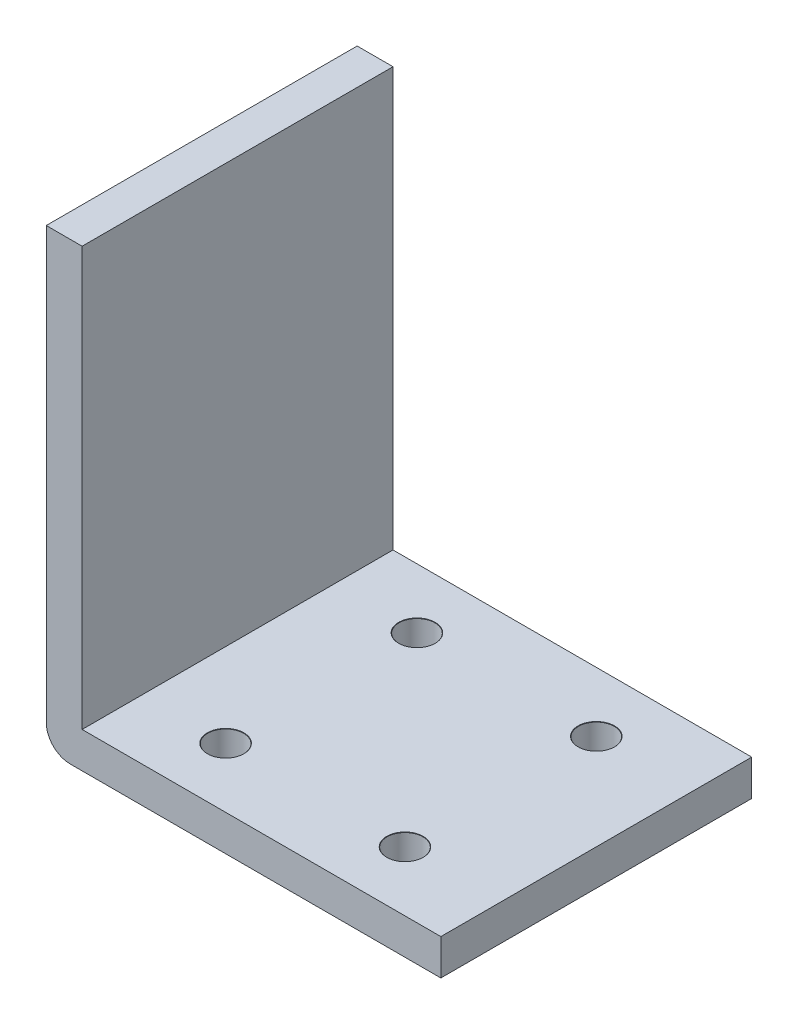
ISO-10303-21;
HEADER;
FILE_DESCRIPTION(('STEP AP214'),'2;1');
FILE_NAME('part.step','',(''),(''),'','','');
FILE_SCHEMA(('AUTOMOTIVE_DESIGN { 1 0 10303 214 1 1 1 1 }'));
ENDSEC;
DATA;
#1=APPLICATION_CONTEXT('core data for automotive mechanical design processes');
#2=APPLICATION_PROTOCOL_DEFINITION('international standard','automotive_design',2000,#1);
#3=PRODUCT_CONTEXT('',#1,'mechanical');
#4=PRODUCT('Part','Part','',(#3));
#5=PRODUCT_RELATED_PRODUCT_CATEGORY('part','',(#4));
#6=PRODUCT_DEFINITION_FORMATION('','',#4);
#7=PRODUCT_DEFINITION_CONTEXT('part definition',#1,'design');
#8=PRODUCT_DEFINITION('design','',#6,#7);
#9=PRODUCT_DEFINITION_SHAPE('','',#8);
#10=(LENGTH_UNIT() NAMED_UNIT(*) SI_UNIT(.MILLI.,.METRE.));
#11=(NAMED_UNIT(*) PLANE_ANGLE_UNIT() SI_UNIT($,.RADIAN.));
#12=(NAMED_UNIT(*) SI_UNIT($,.STERADIAN.) SOLID_ANGLE_UNIT());
#13=UNCERTAINTY_MEASURE_WITH_UNIT(LENGTH_MEASURE(1.E-05),#10,'distance_accuracy_value','');
#14=(GEOMETRIC_REPRESENTATION_CONTEXT(3) GLOBAL_UNCERTAINTY_ASSIGNED_CONTEXT((#13)) GLOBAL_UNIT_ASSIGNED_CONTEXT((#10,
#11,#12)) REPRESENTATION_CONTEXT('',''));
#15=CARTESIAN_POINT('',(0.,0.,0.));
#16=DIRECTION('',(0.,0.,1.));
#17=DIRECTION('',(1.,0.,0.));
#18=AXIS2_PLACEMENT_3D('',#15,#16,#17);
#19=CARTESIAN_POINT('',(0.,3.,0.));
#20=DIRECTION('',(0.,-1.,0.));
#21=DIRECTION('',(0.,0.,-1.));
#22=AXIS2_PLACEMENT_3D('',#19,#20,#21);
#23=PLANE('',#22);
#24=CARTESIAN_POINT('',(25.,3.,-21.));
#25=DIRECTION('',(0.,1.,0.));
#26=DIRECTION('',(0.,0.,1.));
#27=AXIS2_PLACEMENT_3D('',#24,#25,#26);
#28=CIRCLE('',#27,1.525);
#29=CARTESIAN_POINT('',(25.,3.,-19.475));
#30=VERTEX_POINT('',#29);
#31=EDGE_CURVE('E316',#30,#30,#28,.T.);
#32=ORIENTED_EDGE('',*,*,#31,.F.);
#33=EDGE_LOOP('',(#32));
#34=FACE_BOUND('',#33,.T.);
#35=CARTESIAN_POINT('',(9.99999999999999,3.,-21.));
#36=DIRECTION('',(0.,1.,0.));
#37=DIRECTION('',(0.,0.,1.));
#38=AXIS2_PLACEMENT_3D('',#35,#36,#37);
#39=CIRCLE('',#38,1.525);
#40=CARTESIAN_POINT('',(9.99999999999999,3.,-19.475));
#41=VERTEX_POINT('',#40);
#42=EDGE_CURVE('E323',#41,#41,#39,.T.);
#43=ORIENTED_EDGE('',*,*,#42,.F.);
#44=EDGE_LOOP('',(#43));
#45=FACE_BOUND('',#44,.T.);
#46=CARTESIAN_POINT('',(25.,3.,-5.));
#47=DIRECTION('',(0.,1.,0.));
#48=DIRECTION('',(0.,0.,1.));
#49=AXIS2_PLACEMENT_3D('',#46,#47,#48);
#50=CIRCLE('',#49,1.525);
#51=CARTESIAN_POINT('',(25.,3.,-3.475));
#52=VERTEX_POINT('',#51);
#53=EDGE_CURVE('E332',#52,#52,#50,.T.);
#54=ORIENTED_EDGE('',*,*,#53,.F.);
#55=EDGE_LOOP('',(#54));
#56=FACE_BOUND('',#55,.T.);
#57=DIRECTION('',(0.,0.,-1.));
#58=VECTOR('',#57,1.);
#59=CARTESIAN_POINT('',(3.,3.,-26.));
#60=LINE('',#59,#58);
#61=CARTESIAN_POINT('',(3.,3.,0.));
#62=VERTEX_POINT('',#61);
#63=CARTESIAN_POINT('',(3.,3.,-26.));
#64=VERTEX_POINT('',#63);
#65=EDGE_CURVE('E116',#62,#64,#60,.T.);
#66=ORIENTED_EDGE('',*,*,#65,.F.);
#67=DIRECTION('',(1.,0.,0.));
#68=VECTOR('',#67,1.);
#69=CARTESIAN_POINT('',(0.,3.,0.));
#70=LINE('',#69,#68);
#71=CARTESIAN_POINT('',(33.,3.,0.));
#72=VERTEX_POINT('',#71);
#73=EDGE_CURVE('E131',#62,#72,#70,.T.);
#74=ORIENTED_EDGE('',*,*,#73,.T.);
#75=DIRECTION('',(0.,0.,-1.));
#76=VECTOR('',#75,1.);
#77=CARTESIAN_POINT('',(33.,3.,0.));
#78=LINE('',#77,#76);
#79=CARTESIAN_POINT('',(33.,3.,-26.));
#80=VERTEX_POINT('',#79);
#81=EDGE_CURVE('E133',#72,#80,#78,.T.);
#82=ORIENTED_EDGE('',*,*,#81,.T.);
#83=DIRECTION('',(-1.,0.,0.));
#84=VECTOR('',#83,1.);
#85=CARTESIAN_POINT('',(0.,3.,-26.));
#86=LINE('',#85,#84);
#87=EDGE_CURVE('E136',#80,#64,#86,.T.);
#88=ORIENTED_EDGE('',*,*,#87,.T.);
#89=EDGE_LOOP('',(#66,#74,#82,#88));
#90=FACE_BOUND('',#89,.T.);
#91=CARTESIAN_POINT('',(10.,3.,-5.));
#92=DIRECTION('',(0.,1.,0.));
#93=DIRECTION('',(0.,0.,1.));
#94=AXIS2_PLACEMENT_3D('',#91,#92,#93);
#95=CIRCLE('',#94,1.525);
#96=CARTESIAN_POINT('',(10.,3.,-3.475));
#97=VERTEX_POINT('',#96);
#98=EDGE_CURVE('E341',#97,#97,#95,.T.);
#99=ORIENTED_EDGE('',*,*,#98,.F.);
#100=EDGE_LOOP('',(#99));
#101=FACE_BOUND('',#100,.T.);
#102=ADVANCED_FACE('F34',(#34,#45,#56,#90,#101),#23,.F.);
#103=CARTESIAN_POINT('',(0.,0.,0.));
#104=DIRECTION('',(0.,-1.,0.));
#105=DIRECTION('',(0.,0.,-1.));
#106=AXIS2_PLACEMENT_3D('',#103,#104,#105);
#107=PLANE('',#106);
#108=CARTESIAN_POINT('',(25.,0.,-21.));
#109=DIRECTION('',(0.,1.,0.));
#110=DIRECTION('',(0.,0.,1.));
#111=AXIS2_PLACEMENT_3D('',#108,#109,#110);
#112=CIRCLE('',#111,1.5);
#113=CARTESIAN_POINT('',(25.,0.,-19.5));
#114=VERTEX_POINT('',#113);
#115=EDGE_CURVE('E318',#114,#114,#112,.T.);
#116=ORIENTED_EDGE('',*,*,#115,.T.);
#117=EDGE_LOOP('',(#116));
#118=FACE_BOUND('',#117,.T.);
#119=CARTESIAN_POINT('',(9.99999999999999,0.,-21.));
#120=DIRECTION('',(0.,1.,0.));
#121=DIRECTION('',(0.,0.,1.));
#122=AXIS2_PLACEMENT_3D('',#119,#120,#121);
#123=CIRCLE('',#122,1.5);
#124=CARTESIAN_POINT('',(9.99999999999999,0.,-19.5));
#125=VERTEX_POINT('',#124);
#126=EDGE_CURVE('E329',#125,#125,#123,.T.);
#127=ORIENTED_EDGE('',*,*,#126,.T.);
#128=EDGE_LOOP('',(#127));
#129=FACE_BOUND('',#128,.T.);
#130=CARTESIAN_POINT('',(25.,0.,-5.));
#131=DIRECTION('',(0.,1.,0.));
#132=DIRECTION('',(0.,0.,1.));
#133=AXIS2_PLACEMENT_3D('',#130,#131,#132);
#134=CIRCLE('',#133,1.5);
#135=CARTESIAN_POINT('',(25.,0.,-3.5));
#136=VERTEX_POINT('',#135);
#137=EDGE_CURVE('E338',#136,#136,#134,.T.);
#138=ORIENTED_EDGE('',*,*,#137,.T.);
#139=EDGE_LOOP('',(#138));
#140=FACE_BOUND('',#139,.T.);
#141=DIRECTION('',(1.,0.,0.));
#142=VECTOR('',#141,1.);
#143=CARTESIAN_POINT('',(0.,0.,0.));
#144=LINE('',#143,#142);
#145=CARTESIAN_POINT('',(2.,0.,0.));
#146=VERTEX_POINT('',#145);
#147=CARTESIAN_POINT('',(33.,0.,0.));
#148=VERTEX_POINT('',#147);
#149=EDGE_CURVE('E130',#146,#148,#144,.T.);
#150=ORIENTED_EDGE('',*,*,#149,.F.);
#151=DIRECTION('',(0.,0.,1.));
#152=VECTOR('',#151,1.);
#153=CARTESIAN_POINT('',(2.,0.,-26.));
#154=LINE('',#153,#152);
#155=CARTESIAN_POINT('',(2.,0.,-26.));
#156=VERTEX_POINT('',#155);
#157=EDGE_CURVE('E42',#146,#156,#154,.F.);
#158=ORIENTED_EDGE('',*,*,#157,.T.);
#159=DIRECTION('',(-1.,0.,0.));
#160=VECTOR('',#159,1.);
#161=CARTESIAN_POINT('',(0.,0.,-26.));
#162=LINE('',#161,#160);
#163=CARTESIAN_POINT('',(33.,0.,-26.));
#164=VERTEX_POINT('',#163);
#165=EDGE_CURVE('E134',#164,#156,#162,.T.);
#166=ORIENTED_EDGE('',*,*,#165,.F.);
#167=DIRECTION('',(0.,0.,-1.));
#168=VECTOR('',#167,1.);
#169=CARTESIAN_POINT('',(33.,0.,0.));
#170=LINE('',#169,#168);
#171=EDGE_CURVE('E140',#148,#164,#170,.T.);
#172=ORIENTED_EDGE('',*,*,#171,.F.);
#173=EDGE_LOOP('',(#150,#158,#166,#172));
#174=FACE_BOUND('',#173,.T.);
#175=CARTESIAN_POINT('',(10.,0.,-5.));
#176=DIRECTION('',(0.,1.,0.));
#177=DIRECTION('',(0.,0.,1.));
#178=AXIS2_PLACEMENT_3D('',#175,#176,#177);
#179=CIRCLE('',#178,1.5);
#180=CARTESIAN_POINT('',(10.,0.,-3.5));
#181=VERTEX_POINT('',#180);
#182=EDGE_CURVE('E119',#181,#181,#179,.T.);
#183=ORIENTED_EDGE('',*,*,#182,.T.);
#184=EDGE_LOOP('',(#183));
#185=FACE_BOUND('',#184,.T.);
#186=ADVANCED_FACE('F156',(#118,#129,#140,#174,#185),#107,.T.);
#187=CARTESIAN_POINT('',(0.,3.,0.));
#188=DIRECTION('',(1.,0.,0.));
#189=DIRECTION('',(0.,0.,-1.));
#190=AXIS2_PLACEMENT_3D('',#187,#188,#189);
#191=PLANE('',#190);
#192=DIRECTION('',(0.,-1.,0.));
#193=VECTOR('',#192,1.);
#194=CARTESIAN_POINT('',(0.,3.,-26.));
#195=LINE('',#194,#193);
#196=CARTESIAN_POINT('',(0.,38.,-26.));
#197=VERTEX_POINT('',#196);
#198=CARTESIAN_POINT('',(0.,2.,-26.));
#199=VERTEX_POINT('',#198);
#200=EDGE_CURVE('E138',#197,#199,#195,.T.);
#201=ORIENTED_EDGE('',*,*,#200,.T.);
#202=DIRECTION('',(0.,0.,1.));
#203=VECTOR('',#202,1.);
#204=CARTESIAN_POINT('',(0.,2.,0.));
#205=LINE('',#204,#203);
#206=CARTESIAN_POINT('',(0.,2.,0.));
#207=VERTEX_POINT('',#206);
#208=EDGE_CURVE('E99',#199,#207,#205,.T.);
#209=ORIENTED_EDGE('',*,*,#208,.T.);
#210=DIRECTION('',(0.,-1.,0.));
#211=VECTOR('',#210,1.);
#212=CARTESIAN_POINT('',(0.,3.,0.));
#213=LINE('',#212,#211);
#214=CARTESIAN_POINT('',(0.,38.,0.));
#215=VERTEX_POINT('',#214);
#216=EDGE_CURVE('E92',#215,#207,#213,.T.);
#217=ORIENTED_EDGE('',*,*,#216,.F.);
#218=DIRECTION('',(0.,0.,1.));
#219=VECTOR('',#218,1.);
#220=CARTESIAN_POINT('',(0.,38.,-26.));
#221=LINE('',#220,#219);
#222=EDGE_CURVE('E97',#197,#215,#221,.T.);
#223=ORIENTED_EDGE('',*,*,#222,.F.);
#224=EDGE_LOOP('',(#201,#209,#217,#223));
#225=FACE_BOUND('',#224,.T.);
#226=ADVANCED_FACE('F95',(#225),#191,.F.);
#227=CARTESIAN_POINT('',(0.,3.,0.));
#228=DIRECTION('',(0.,0.,-1.));
#229=DIRECTION('',(-1.,0.,0.));
#230=AXIS2_PLACEMENT_3D('',#227,#228,#229);
#231=PLANE('',#230);
#232=ORIENTED_EDGE('',*,*,#216,.T.);
#233=CARTESIAN_POINT('',(2.,2.,0.));
#234=DIRECTION('',(0.,0.,-1.));
#235=DIRECTION('',(-1.,0.,0.));
#236=AXIS2_PLACEMENT_3D('',#233,#234,#235);
#237=CIRCLE('',#236,2.);
#238=EDGE_CURVE('E56',#207,#146,#237,.F.);
#239=ORIENTED_EDGE('',*,*,#238,.T.);
#240=ORIENTED_EDGE('',*,*,#149,.T.);
#241=DIRECTION('',(0.,-1.,0.));
#242=VECTOR('',#241,1.);
#243=CARTESIAN_POINT('',(33.,3.,0.));
#244=LINE('',#243,#242);
#245=EDGE_CURVE('E100',#72,#148,#244,.T.);
#246=ORIENTED_EDGE('',*,*,#245,.F.);
#247=ORIENTED_EDGE('',*,*,#73,.F.);
#248=DIRECTION('',(0.,-1.,0.));
#249=VECTOR('',#248,1.);
#250=CARTESIAN_POINT('',(3.,38.,0.));
#251=LINE('',#250,#249);
#252=CARTESIAN_POINT('',(3.,38.,0.));
#253=VERTEX_POINT('',#252);
#254=EDGE_CURVE('E107',#253,#62,#251,.T.);
#255=ORIENTED_EDGE('',*,*,#254,.F.);
#256=DIRECTION('',(1.,0.,0.));
#257=VECTOR('',#256,1.);
#258=CARTESIAN_POINT('',(0.,38.,0.));
#259=LINE('',#258,#257);
#260=EDGE_CURVE('E103',#215,#253,#259,.T.);
#261=ORIENTED_EDGE('',*,*,#260,.F.);
#262=EDGE_LOOP('',(#232,#239,#240,#246,#247,#255,#261));
#263=FACE_BOUND('',#262,.T.);
#264=ADVANCED_FACE('F104',(#263),#231,.F.);
#265=CARTESIAN_POINT('',(33.,3.,0.));
#266=DIRECTION('',(-1.,0.,0.));
#267=DIRECTION('',(0.,0.,1.));
#268=AXIS2_PLACEMENT_3D('',#265,#266,#267);
#269=PLANE('',#268);
#270=ORIENTED_EDGE('',*,*,#171,.T.);
#271=DIRECTION('',(0.,-1.,0.));
#272=VECTOR('',#271,1.);
#273=CARTESIAN_POINT('',(33.,3.,-26.));
#274=LINE('',#273,#272);
#275=EDGE_CURVE('E144',#80,#164,#274,.T.);
#276=ORIENTED_EDGE('',*,*,#275,.F.);
#277=ORIENTED_EDGE('',*,*,#81,.F.);
#278=ORIENTED_EDGE('',*,*,#245,.T.);
#279=EDGE_LOOP('',(#270,#276,#277,#278));
#280=FACE_BOUND('',#279,.T.);
#281=ADVANCED_FACE('F154',(#280),#269,.F.);
#282=CARTESIAN_POINT('',(0.,3.,-26.));
#283=DIRECTION('',(0.,0.,1.));
#284=DIRECTION('',(1.,0.,0.));
#285=AXIS2_PLACEMENT_3D('',#282,#283,#284);
#286=PLANE('',#285);
#287=ORIENTED_EDGE('',*,*,#165,.T.);
#288=CARTESIAN_POINT('',(2.,2.,-26.));
#289=DIRECTION('',(0.,0.,1.));
#290=DIRECTION('',(1.,0.,0.));
#291=AXIS2_PLACEMENT_3D('',#288,#289,#290);
#292=CIRCLE('',#291,2.);
#293=EDGE_CURVE('E11',#156,#199,#292,.F.);
#294=ORIENTED_EDGE('',*,*,#293,.T.);
#295=ORIENTED_EDGE('',*,*,#200,.F.);
#296=DIRECTION('',(-1.,0.,0.));
#297=VECTOR('',#296,1.);
#298=CARTESIAN_POINT('',(0.,38.,-26.));
#299=LINE('',#298,#297);
#300=CARTESIAN_POINT('',(3.,38.,-26.));
#301=VERTEX_POINT('',#300);
#302=EDGE_CURVE('E115',#301,#197,#299,.T.);
#303=ORIENTED_EDGE('',*,*,#302,.F.);
#304=DIRECTION('',(0.,-1.,0.));
#305=VECTOR('',#304,1.);
#306=CARTESIAN_POINT('',(3.,38.,-26.));
#307=LINE('',#306,#305);
#308=EDGE_CURVE('E125',#301,#64,#307,.T.);
#309=ORIENTED_EDGE('',*,*,#308,.T.);
#310=ORIENTED_EDGE('',*,*,#87,.F.);
#311=ORIENTED_EDGE('',*,*,#275,.T.);
#312=EDGE_LOOP('',(#287,#294,#295,#303,#309,#310,#311));
#313=FACE_BOUND('',#312,.T.);
#314=ADVANCED_FACE('F160',(#313),#286,.F.);
#315=CARTESIAN_POINT('',(3.,38.,-26.));
#316=DIRECTION('',(-1.,0.,0.));
#317=DIRECTION('',(0.,0.,1.));
#318=AXIS2_PLACEMENT_3D('',#315,#316,#317);
#319=PLANE('',#318);
#320=ORIENTED_EDGE('',*,*,#65,.T.);
#321=ORIENTED_EDGE('',*,*,#308,.F.);
#322=DIRECTION('',(0.,0.,-1.));
#323=VECTOR('',#322,1.);
#324=CARTESIAN_POINT('',(3.,38.,-26.));
#325=LINE('',#324,#323);
#326=EDGE_CURVE('E110',#253,#301,#325,.T.);
#327=ORIENTED_EDGE('',*,*,#326,.F.);
#328=ORIENTED_EDGE('',*,*,#254,.T.);
#329=EDGE_LOOP('',(#320,#321,#327,#328));
#330=FACE_BOUND('',#329,.T.);
#331=ADVANCED_FACE('F172',(#330),#319,.F.);
#332=CARTESIAN_POINT('',(0.,38.,0.));
#333=DIRECTION('',(0.,1.,0.));
#334=DIRECTION('',(0.,0.,1.));
#335=AXIS2_PLACEMENT_3D('',#332,#333,#334);
#336=PLANE('',#335);
#337=ORIENTED_EDGE('',*,*,#222,.T.);
#338=ORIENTED_EDGE('',*,*,#260,.T.);
#339=ORIENTED_EDGE('',*,*,#326,.T.);
#340=ORIENTED_EDGE('',*,*,#302,.T.);
#341=EDGE_LOOP('',(#337,#338,#339,#340));
#342=FACE_BOUND('',#341,.T.);
#343=ADVANCED_FACE('F113',(#342),#336,.T.);
#344=CARTESIAN_POINT('',(2.,2.,0.));
#345=DIRECTION('',(0.,0.,-1.));
#346=DIRECTION('',(-1.,0.,0.));
#347=AXIS2_PLACEMENT_3D('',#344,#345,#346);
#348=CYLINDRICAL_SURFACE('',#347,2.);
#349=ORIENTED_EDGE('',*,*,#293,.F.);
#350=ORIENTED_EDGE('',*,*,#157,.F.);
#351=ORIENTED_EDGE('',*,*,#238,.F.);
#352=ORIENTED_EDGE('',*,*,#208,.F.);
#353=EDGE_LOOP('',(#349,#350,#351,#352));
#354=FACE_BOUND('',#353,.T.);
#355=ADVANCED_FACE('F36',(#354),#348,.T.);
#356=CARTESIAN_POINT('',(10.,3.,-5.));
#357=DIRECTION('',(0.,1.,0.));
#358=DIRECTION('',(0.,0.,1.));
#359=AXIS2_PLACEMENT_3D('',#356,#357,#358);
#360=CYLINDRICAL_SURFACE('',#359,1.5);
#361=ORIENTED_EDGE('',*,*,#182,.F.);
#362=EDGE_LOOP('',(#361));
#363=FACE_BOUND('',#362,.T.);
#364=CARTESIAN_POINT('',(10.,2.975,-5.));
#365=DIRECTION('',(0.,1.,0.));
#366=DIRECTION('',(0.,0.,1.));
#367=AXIS2_PLACEMENT_3D('',#364,#365,#366);
#368=CIRCLE('',#367,1.5);
#369=CARTESIAN_POINT('',(10.,2.975,-3.5));
#370=VERTEX_POINT('',#369);
#371=EDGE_CURVE('E343',#370,#370,#368,.T.);
#372=ORIENTED_EDGE('',*,*,#371,.T.);
#373=EDGE_LOOP('',(#372));
#374=FACE_BOUND('',#373,.T.);
#375=ADVANCED_FACE('F164',(#363,#374),#360,.F.);
#376=CARTESIAN_POINT('',(10.,3.,-5.));
#377=DIRECTION('',(0.,1.,0.));
#378=DIRECTION('',(0.,0.,1.));
#379=AXIS2_PLACEMENT_3D('',#376,#377,#378);
#380=CONICAL_SURFACE('',#379,1.525,0.785398163397431);
#381=ORIENTED_EDGE('',*,*,#371,.F.);
#382=EDGE_LOOP('',(#381));
#383=FACE_BOUND('',#382,.T.);
#384=ORIENTED_EDGE('',*,*,#98,.T.);
#385=EDGE_LOOP('',(#384));
#386=FACE_BOUND('',#385,.T.);
#387=ADVANCED_FACE('F169',(#383,#386),#380,.F.);
#388=CARTESIAN_POINT('',(25.,3.,-5.));
#389=DIRECTION('',(0.,1.,0.));
#390=DIRECTION('',(0.,0.,1.));
#391=AXIS2_PLACEMENT_3D('',#388,#389,#390);
#392=CYLINDRICAL_SURFACE('',#391,1.5);
#393=ORIENTED_EDGE('',*,*,#137,.F.);
#394=EDGE_LOOP('',(#393));
#395=FACE_BOUND('',#394,.T.);
#396=CARTESIAN_POINT('',(25.,2.975,-5.));
#397=DIRECTION('',(0.,1.,0.));
#398=DIRECTION('',(0.,0.,1.));
#399=AXIS2_PLACEMENT_3D('',#396,#397,#398);
#400=CIRCLE('',#399,1.5);
#401=CARTESIAN_POINT('',(25.,2.975,-3.5));
#402=VERTEX_POINT('',#401);
#403=EDGE_CURVE('E335',#402,#402,#400,.T.);
#404=ORIENTED_EDGE('',*,*,#403,.T.);
#405=EDGE_LOOP('',(#404));
#406=FACE_BOUND('',#405,.T.);
#407=ADVANCED_FACE('F247',(#395,#406),#392,.F.);
#408=CARTESIAN_POINT('',(25.,3.,-5.));
#409=DIRECTION('',(0.,1.,0.));
#410=DIRECTION('',(0.,0.,1.));
#411=AXIS2_PLACEMENT_3D('',#408,#409,#410);
#412=CONICAL_SURFACE('',#411,1.525,0.785398163397362);
#413=ORIENTED_EDGE('',*,*,#403,.F.);
#414=EDGE_LOOP('',(#413));
#415=FACE_BOUND('',#414,.T.);
#416=ORIENTED_EDGE('',*,*,#53,.T.);
#417=EDGE_LOOP('',(#416));
#418=FACE_BOUND('',#417,.T.);
#419=ADVANCED_FACE('F256',(#415,#418),#412,.F.);
#420=CARTESIAN_POINT('',(9.99999999999999,3.,-21.));
#421=DIRECTION('',(0.,1.,0.));
#422=DIRECTION('',(0.,0.,1.));
#423=AXIS2_PLACEMENT_3D('',#420,#421,#422);
#424=CYLINDRICAL_SURFACE('',#423,1.5);
#425=ORIENTED_EDGE('',*,*,#126,.F.);
#426=EDGE_LOOP('',(#425));
#427=FACE_BOUND('',#426,.T.);
#428=CARTESIAN_POINT('',(9.99999999999999,2.975,-21.));
#429=DIRECTION('',(0.,1.,0.));
#430=DIRECTION('',(0.,0.,1.));
#431=AXIS2_PLACEMENT_3D('',#428,#429,#430);
#432=CIRCLE('',#431,1.5);
#433=CARTESIAN_POINT('',(9.99999999999999,2.975,-19.5));
#434=VERTEX_POINT('',#433);
#435=EDGE_CURVE('E326',#434,#434,#432,.T.);
#436=ORIENTED_EDGE('',*,*,#435,.T.);
#437=EDGE_LOOP('',(#436));
#438=FACE_BOUND('',#437,.T.);
#439=ADVANCED_FACE('F265',(#427,#438),#424,.F.);
#440=CARTESIAN_POINT('',(9.99999999999999,3.,-21.));
#441=DIRECTION('',(0.,1.,0.));
#442=DIRECTION('',(0.,0.,1.));
#443=AXIS2_PLACEMENT_3D('',#440,#441,#442);
#444=CONICAL_SURFACE('',#443,1.525,0.785398163397431);
#445=ORIENTED_EDGE('',*,*,#435,.F.);
#446=EDGE_LOOP('',(#445));
#447=FACE_BOUND('',#446,.T.);
#448=ORIENTED_EDGE('',*,*,#42,.T.);
#449=EDGE_LOOP('',(#448));
#450=FACE_BOUND('',#449,.T.);
#451=ADVANCED_FACE('F274',(#447,#450),#444,.F.);
#452=CARTESIAN_POINT('',(25.,3.,-21.));
#453=DIRECTION('',(0.,1.,0.));
#454=DIRECTION('',(0.,0.,1.));
#455=AXIS2_PLACEMENT_3D('',#452,#453,#454);
#456=CYLINDRICAL_SURFACE('',#455,1.5);
#457=ORIENTED_EDGE('',*,*,#115,.F.);
#458=EDGE_LOOP('',(#457));
#459=FACE_BOUND('',#458,.T.);
#460=CARTESIAN_POINT('',(25.,2.975,-21.));
#461=DIRECTION('',(0.,1.,0.));
#462=DIRECTION('',(0.,0.,1.));
#463=AXIS2_PLACEMENT_3D('',#460,#461,#462);
#464=CIRCLE('',#463,1.5);
#465=CARTESIAN_POINT('',(25.,2.975,-19.5));
#466=VERTEX_POINT('',#465);
#467=EDGE_CURVE('E314',#466,#466,#464,.T.);
#468=ORIENTED_EDGE('',*,*,#467,.T.);
#469=EDGE_LOOP('',(#468));
#470=FACE_BOUND('',#469,.T.);
#471=ADVANCED_FACE('F283',(#459,#470),#456,.F.);
#472=CARTESIAN_POINT('',(25.,3.,-21.));
#473=DIRECTION('',(0.,1.,0.));
#474=DIRECTION('',(0.,0.,1.));
#475=AXIS2_PLACEMENT_3D('',#472,#473,#474);
#476=CONICAL_SURFACE('',#475,1.525,0.785398163397362);
#477=ORIENTED_EDGE('',*,*,#467,.F.);
#478=EDGE_LOOP('',(#477));
#479=FACE_BOUND('',#478,.T.);
#480=ORIENTED_EDGE('',*,*,#31,.T.);
#481=EDGE_LOOP('',(#480));
#482=FACE_BOUND('',#481,.T.);
#483=ADVANCED_FACE('F292',(#479,#482),#476,.F.);
#484=CLOSED_SHELL('',(#102,#186,#226,#264,#281,#314,#331,#343,#355,#375,#387,#407,#419,#439,
#451,#471,#483));
#485=MANIFOLD_SOLID_BREP('B2',#484);
#486=ADVANCED_BREP_SHAPE_REPRESENTATION('',(#18,#485),#14);
#487=SHAPE_DEFINITION_REPRESENTATION(#9,#486);
ENDSEC;
END-ISO-10303-21;
